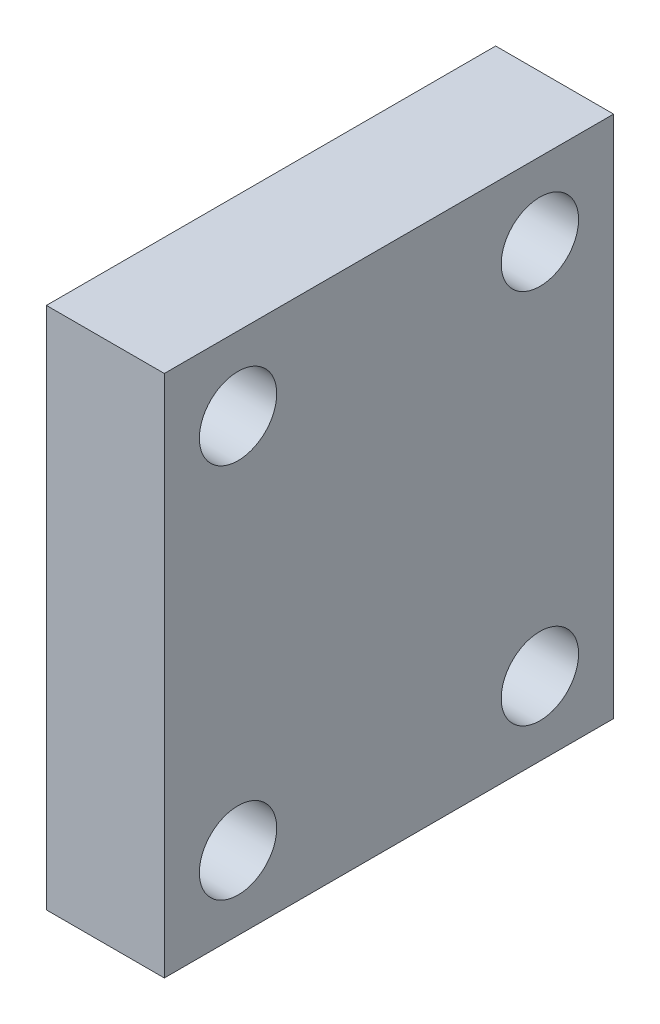
ISO-10303-21;
HEADER;
FILE_DESCRIPTION(('STEP AP214'),'2;1');
FILE_NAME('part.step','',(''),(''),'','','');
FILE_SCHEMA(('AUTOMOTIVE_DESIGN { 1 0 10303 214 1 1 1 1 }'));
ENDSEC;
DATA;
#1=APPLICATION_CONTEXT('core data for automotive mechanical design processes');
#2=APPLICATION_PROTOCOL_DEFINITION('international standard','automotive_design',2000,#1);
#3=PRODUCT_CONTEXT('',#1,'mechanical');
#4=PRODUCT('Part','Part','',(#3));
#5=PRODUCT_RELATED_PRODUCT_CATEGORY('part','',(#4));
#6=PRODUCT_DEFINITION_FORMATION('','',#4);
#7=PRODUCT_DEFINITION_CONTEXT('part definition',#1,'design');
#8=PRODUCT_DEFINITION('design','',#6,#7);
#9=PRODUCT_DEFINITION_SHAPE('','',#8);
#10=(LENGTH_UNIT() NAMED_UNIT(*) SI_UNIT(.MILLI.,.METRE.));
#11=(NAMED_UNIT(*) PLANE_ANGLE_UNIT() SI_UNIT($,.RADIAN.));
#12=(NAMED_UNIT(*) SI_UNIT($,.STERADIAN.) SOLID_ANGLE_UNIT());
#13=UNCERTAINTY_MEASURE_WITH_UNIT(LENGTH_MEASURE(1.E-05),#10,'distance_accuracy_value','');
#14=(GEOMETRIC_REPRESENTATION_CONTEXT(3) GLOBAL_UNCERTAINTY_ASSIGNED_CONTEXT((#13)) GLOBAL_UNIT_ASSIGNED_CONTEXT((#10,
#11,#12)) REPRESENTATION_CONTEXT('',''));
#15=CARTESIAN_POINT('',(0.,0.,0.));
#16=DIRECTION('',(0.,0.,1.));
#17=DIRECTION('',(1.,0.,0.));
#18=AXIS2_PLACEMENT_3D('',#15,#16,#17);
#19=CARTESIAN_POINT('',(25.4,0.,0.));
#20=DIRECTION('',(0.,1.,0.));
#21=DIRECTION('',(0.,0.,1.));
#22=AXIS2_PLACEMENT_3D('',#19,#20,#21);
#23=PLANE('',#22);
#24=DIRECTION('',(-1.,0.,0.));
#25=VECTOR('',#24,1.);
#26=CARTESIAN_POINT('',(12.7,0.,53.213));
#27=LINE('',#26,#25);
#28=CARTESIAN_POINT('',(0.,0.,53.213));
#29=VERTEX_POINT('',#28);
#30=CARTESIAN_POINT('',(12.7,0.,53.213));
#31=VERTEX_POINT('',#30);
#32=EDGE_CURVE('E148',#29,#31,#27,.F.);
#33=ORIENTED_EDGE('',*,*,#32,.F.);
#34=DIRECTION('',(0.,0.,-1.));
#35=VECTOR('',#34,1.);
#36=CARTESIAN_POINT('',(0.,0.,0.));
#37=LINE('',#36,#35);
#38=CARTESIAN_POINT('',(0.,0.,0.));
#39=VERTEX_POINT('',#38);
#40=EDGE_CURVE('E136',#29,#39,#37,.T.);
#41=ORIENTED_EDGE('',*,*,#40,.T.);
#42=DIRECTION('',(-1.,0.,0.));
#43=VECTOR('',#42,1.);
#44=CARTESIAN_POINT('',(25.4,0.,0.));
#45=LINE('',#44,#43);
#46=CARTESIAN_POINT('',(25.4,0.,0.));
#47=VERTEX_POINT('',#46);
#48=EDGE_CURVE('E287',#47,#39,#45,.T.);
#49=ORIENTED_EDGE('',*,*,#48,.F.);
#50=DIRECTION('',(0.,0.,-1.));
#51=VECTOR('',#50,1.);
#52=CARTESIAN_POINT('',(25.4,0.,0.));
#53=LINE('',#52,#51);
#54=CARTESIAN_POINT('',(25.4,0.,96.774));
#55=VERTEX_POINT('',#54);
#56=EDGE_CURVE('E264',#55,#47,#53,.T.);
#57=ORIENTED_EDGE('',*,*,#56,.F.);
#58=DIRECTION('',(-1.,0.,0.));
#59=VECTOR('',#58,1.);
#60=CARTESIAN_POINT('',(25.4,0.,96.774));
#61=LINE('',#60,#59);
#62=CARTESIAN_POINT('',(0.,0.,96.774));
#63=VERTEX_POINT('',#62);
#64=EDGE_CURVE('E273',#55,#63,#61,.T.);
#65=ORIENTED_EDGE('',*,*,#64,.T.);
#66=CARTESIAN_POINT('',(0.,0.,59.563));
#67=VERTEX_POINT('',#66);
#68=EDGE_CURVE('E145',#63,#67,#37,.T.);
#69=ORIENTED_EDGE('',*,*,#68,.T.);
#70=DIRECTION('',(-1.,0.,0.));
#71=VECTOR('',#70,1.);
#72=CARTESIAN_POINT('',(12.7,0.,59.563));
#73=LINE('',#72,#71);
#74=CARTESIAN_POINT('',(12.7,0.,59.563));
#75=VERTEX_POINT('',#74);
#76=EDGE_CURVE('E56',#75,#67,#73,.T.);
#77=ORIENTED_EDGE('',*,*,#76,.F.);
#78=DIRECTION('',(0.,0.,-1.));
#79=VECTOR('',#78,1.);
#80=CARTESIAN_POINT('',(12.7,0.,0.));
#81=LINE('',#80,#79);
#82=EDGE_CURVE('E11',#75,#31,#81,.T.);
#83=ORIENTED_EDGE('',*,*,#82,.T.);
#84=EDGE_LOOP('',(#33,#41,#49,#57,#65,#69,#77,#83));
#85=FACE_BOUND('',#84,.T.);
#86=ADVANCED_FACE('F39',(#85),#23,.F.);
#87=CARTESIAN_POINT('',(12.7,74.549,48.387));
#88=DIRECTION('',(-1.,0.,0.));
#89=DIRECTION('',(0.,0.,1.));
#90=AXIS2_PLACEMENT_3D('',#87,#88,#89);
#91=CYLINDRICAL_SURFACE('',#90,11.509375);
#92=CARTESIAN_POINT('',(2.8194,74.549,48.387));
#93=DIRECTION('',(1.,0.,0.));
#94=DIRECTION('',(0.,0.,-1.));
#95=AXIS2_PLACEMENT_3D('',#92,#93,#94);
#96=CIRCLE('',#95,11.509375);
#97=CARTESIAN_POINT('',(2.8194,71.8767199958881,37.1921515208892));
#98=VERTEX_POINT('',#97);
#99=CARTESIAN_POINT('',(2.8194,79.375,37.9382949658522));
#100=VERTEX_POINT('',#99);
#101=EDGE_CURVE('E197',#98,#100,#96,.T.);
#102=ORIENTED_EDGE('',*,*,#101,.F.);
#103=DIRECTION('',(-1.,0.,0.));
#104=VECTOR('',#103,1.);
#105=CARTESIAN_POINT('',(1.4097,71.8767199958881,37.1921515208892));
#106=LINE('',#105,#104);
#107=CARTESIAN_POINT('',(0.,71.8767199958881,37.1921515208892));
#108=VERTEX_POINT('',#107);
#109=EDGE_CURVE('E204',#98,#108,#106,.T.);
#110=ORIENTED_EDGE('',*,*,#109,.T.);
#111=CARTESIAN_POINT('',(0.,74.549,48.387));
#112=DIRECTION('',(1.,0.,0.));
#113=DIRECTION('',(0.,0.,-1.));
#114=AXIS2_PLACEMENT_3D('',#111,#112,#113);
#115=CIRCLE('',#114,11.509375);
#116=CARTESIAN_POINT('',(0.,71.8767199958881,59.5818484791108));
#117=VERTEX_POINT('',#116);
#118=EDGE_CURVE('E237',#117,#108,#115,.T.);
#119=ORIENTED_EDGE('',*,*,#118,.F.);
#120=DIRECTION('',(-1.,0.,0.));
#121=VECTOR('',#120,1.);
#122=CARTESIAN_POINT('',(1.4097,71.8767199958881,59.5818484791108));
#123=LINE('',#122,#121);
#124=CARTESIAN_POINT('',(2.8194,71.8767199958881,59.5818484791108));
#125=VERTEX_POINT('',#124);
#126=EDGE_CURVE('E201',#117,#125,#123,.F.);
#127=ORIENTED_EDGE('',*,*,#126,.T.);
#128=CARTESIAN_POINT('',(2.8194,79.375,58.8357050341478));
#129=VERTEX_POINT('',#128);
#130=EDGE_CURVE('E187',#129,#125,#96,.T.);
#131=ORIENTED_EDGE('',*,*,#130,.F.);
#132=DIRECTION('',(-1.,0.,0.));
#133=VECTOR('',#132,1.);
#134=CARTESIAN_POINT('',(6.35,79.375,58.8357050341478));
#135=LINE('',#134,#133);
#136=CARTESIAN_POINT('',(12.7,79.375,58.8357050341478));
#137=VERTEX_POINT('',#136);
#138=EDGE_CURVE('E224',#129,#137,#135,.F.);
#139=ORIENTED_EDGE('',*,*,#138,.T.);
#140=CARTESIAN_POINT('',(12.7,74.549,48.387));
#141=DIRECTION('',(1.,0.,0.));
#142=DIRECTION('',(0.,0.,-1.));
#143=AXIS2_PLACEMENT_3D('',#140,#141,#142);
#144=CIRCLE('',#143,11.509375);
#145=CARTESIAN_POINT('',(12.7,79.375,37.9382949658522));
#146=VERTEX_POINT('',#145);
#147=EDGE_CURVE('E229',#137,#146,#144,.T.);
#148=ORIENTED_EDGE('',*,*,#147,.T.);
#149=DIRECTION('',(-1.,0.,0.));
#150=VECTOR('',#149,1.);
#151=CARTESIAN_POINT('',(6.35,79.375,37.9382949658522));
#152=LINE('',#151,#150);
#153=EDGE_CURVE('E226',#146,#100,#152,.T.);
#154=ORIENTED_EDGE('',*,*,#153,.T.);
#155=EDGE_LOOP('',(#102,#110,#119,#127,#131,#139,#148,#154));
#156=FACE_BOUND('',#155,.T.);
#157=ADVANCED_FACE('F324',(#156),#91,.F.);
#158=CARTESIAN_POINT('',(12.7,28.575,48.387));
#159=DIRECTION('',(-1.,0.,0.));
#160=DIRECTION('',(0.,0.,1.));
#161=AXIS2_PLACEMENT_3D('',#158,#159,#160);
#162=CYLINDRICAL_SURFACE('',#161,11.509375);
#163=CARTESIAN_POINT('',(2.8194,28.575,48.387));
#164=DIRECTION('',(1.,0.,0.));
#165=DIRECTION('',(0.,0.,-1.));
#166=AXIS2_PLACEMENT_3D('',#163,#164,#165);
#167=CIRCLE('',#166,11.509375);
#168=CARTESIAN_POINT('',(2.8194,25.9027199958881,37.1921515208892));
#169=VERTEX_POINT('',#168);
#170=CARTESIAN_POINT('',(2.8194,33.401,37.9382949658522));
#171=VERTEX_POINT('',#170);
#172=EDGE_CURVE('E200',#169,#171,#167,.T.);
#173=ORIENTED_EDGE('',*,*,#172,.F.);
#174=DIRECTION('',(-1.,0.,0.));
#175=VECTOR('',#174,1.);
#176=CARTESIAN_POINT('',(1.4097,25.9027199958881,37.1921515208892));
#177=LINE('',#176,#175);
#178=CARTESIAN_POINT('',(0.,25.9027199958881,37.1921515208892));
#179=VERTEX_POINT('',#178);
#180=EDGE_CURVE('E210',#169,#179,#177,.T.);
#181=ORIENTED_EDGE('',*,*,#180,.T.);
#182=CARTESIAN_POINT('',(0.,28.575,48.387));
#183=DIRECTION('',(1.,0.,0.));
#184=DIRECTION('',(0.,0.,-1.));
#185=AXIS2_PLACEMENT_3D('',#182,#183,#184);
#186=CIRCLE('',#185,11.509375);
#187=CARTESIAN_POINT('',(0.,25.9027199958881,59.5818484791108));
#188=VERTEX_POINT('',#187);
#189=EDGE_CURVE('E234',#188,#179,#186,.T.);
#190=ORIENTED_EDGE('',*,*,#189,.F.);
#191=DIRECTION('',(-1.,0.,0.));
#192=VECTOR('',#191,1.);
#193=CARTESIAN_POINT('',(1.4097,25.9027199958881,59.5818484791108));
#194=LINE('',#193,#192);
#195=CARTESIAN_POINT('',(2.8194,25.9027199958881,59.5818484791108));
#196=VERTEX_POINT('',#195);
#197=EDGE_CURVE('E207',#188,#196,#194,.F.);
#198=ORIENTED_EDGE('',*,*,#197,.T.);
#199=CARTESIAN_POINT('',(2.8194,33.401,58.8357050341478));
#200=VERTEX_POINT('',#199);
#201=EDGE_CURVE('E198',#200,#196,#167,.T.);
#202=ORIENTED_EDGE('',*,*,#201,.F.);
#203=DIRECTION('',(-1.,0.,0.));
#204=VECTOR('',#203,1.);
#205=CARTESIAN_POINT('',(6.35,33.401,58.8357050341478));
#206=LINE('',#205,#204);
#207=CARTESIAN_POINT('',(12.7,33.401,58.8357050341478));
#208=VERTEX_POINT('',#207);
#209=EDGE_CURVE('E217',#200,#208,#206,.F.);
#210=ORIENTED_EDGE('',*,*,#209,.T.);
#211=CARTESIAN_POINT('',(12.7,28.575,48.387));
#212=DIRECTION('',(1.,0.,0.));
#213=DIRECTION('',(0.,0.,-1.));
#214=AXIS2_PLACEMENT_3D('',#211,#212,#213);
#215=CIRCLE('',#214,11.509375);
#216=CARTESIAN_POINT('',(12.7,33.401,37.9382949658522));
#217=VERTEX_POINT('',#216);
#218=EDGE_CURVE('E230',#208,#217,#215,.T.);
#219=ORIENTED_EDGE('',*,*,#218,.T.);
#220=DIRECTION('',(-1.,0.,0.));
#221=VECTOR('',#220,1.);
#222=CARTESIAN_POINT('',(6.35,33.401,37.9382949658522));
#223=LINE('',#222,#221);
#224=EDGE_CURVE('E221',#217,#171,#223,.T.);
#225=ORIENTED_EDGE('',*,*,#224,.T.);
#226=EDGE_LOOP('',(#173,#181,#190,#198,#202,#210,#219,#225));
#227=FACE_BOUND('',#226,.T.);
#228=ADVANCED_FACE('F300',(#227),#162,.F.);
#229=CARTESIAN_POINT('',(25.4,0.,0.));
#230=DIRECTION('',(0.,0.,1.));
#231=DIRECTION('',(1.,0.,0.));
#232=AXIS2_PLACEMENT_3D('',#229,#230,#231);
#233=PLANE('',#232);
#234=DIRECTION('',(0.,1.,0.));
#235=VECTOR('',#234,1.);
#236=CARTESIAN_POINT('',(0.,0.,0.));
#237=LINE('',#236,#235);
#238=CARTESIAN_POINT('',(0.,112.776,0.));
#239=VERTEX_POINT('',#238);
#240=EDGE_CURVE('E142',#39,#239,#237,.T.);
#241=ORIENTED_EDGE('',*,*,#240,.T.);
#242=DIRECTION('',(-1.,0.,0.));
#243=VECTOR('',#242,1.);
#244=CARTESIAN_POINT('',(25.4,112.776,0.));
#245=LINE('',#244,#243);
#246=CARTESIAN_POINT('',(25.4,112.776,0.));
#247=VERTEX_POINT('',#246);
#248=EDGE_CURVE('E284',#247,#239,#245,.T.);
#249=ORIENTED_EDGE('',*,*,#248,.F.);
#250=DIRECTION('',(0.,1.,0.));
#251=VECTOR('',#250,1.);
#252=CARTESIAN_POINT('',(25.4,0.,0.));
#253=LINE('',#252,#251);
#254=EDGE_CURVE('E267',#47,#247,#253,.T.);
#255=ORIENTED_EDGE('',*,*,#254,.F.);
#256=ORIENTED_EDGE('',*,*,#48,.T.);
#257=EDGE_LOOP('',(#241,#249,#255,#256));
#258=FACE_BOUND('',#257,.T.);
#259=ADVANCED_FACE('F336',(#258),#233,.F.);
#260=CARTESIAN_POINT('',(25.4,112.776,0.));
#261=DIRECTION('',(0.,-1.,0.));
#262=DIRECTION('',(0.,0.,-1.));
#263=AXIS2_PLACEMENT_3D('',#260,#261,#262);
#264=PLANE('',#263);
#265=DIRECTION('',(0.,0.,1.));
#266=VECTOR('',#265,1.);
#267=CARTESIAN_POINT('',(0.,112.776,0.));
#268=LINE('',#267,#266);
#269=CARTESIAN_POINT('',(0.,112.776,96.774));
#270=VERTEX_POINT('',#269);
#271=EDGE_CURVE('E276',#239,#270,#268,.T.);
#272=ORIENTED_EDGE('',*,*,#271,.T.);
#273=DIRECTION('',(-1.,0.,0.));
#274=VECTOR('',#273,1.);
#275=CARTESIAN_POINT('',(25.4,112.776,96.774));
#276=LINE('',#275,#274);
#277=CARTESIAN_POINT('',(25.4,112.776,96.774));
#278=VERTEX_POINT('',#277);
#279=EDGE_CURVE('E281',#278,#270,#276,.T.);
#280=ORIENTED_EDGE('',*,*,#279,.F.);
#281=DIRECTION('',(0.,0.,1.));
#282=VECTOR('',#281,1.);
#283=CARTESIAN_POINT('',(25.4,112.776,0.));
#284=LINE('',#283,#282);
#285=EDGE_CURVE('E270',#247,#278,#284,.T.);
#286=ORIENTED_EDGE('',*,*,#285,.F.);
#287=ORIENTED_EDGE('',*,*,#248,.T.);
#288=EDGE_LOOP('',(#272,#280,#286,#287));
#289=FACE_BOUND('',#288,.T.);
#290=ADVANCED_FACE('F370',(#289),#264,.F.);
#291=CARTESIAN_POINT('',(25.4,0.,96.774));
#292=DIRECTION('',(0.,0.,-1.));
#293=DIRECTION('',(-1.,0.,0.));
#294=AXIS2_PLACEMENT_3D('',#291,#292,#293);
#295=PLANE('',#294);
#296=DIRECTION('',(0.,-1.,0.));
#297=VECTOR('',#296,1.);
#298=CARTESIAN_POINT('',(0.,0.,96.774));
#299=LINE('',#298,#297);
#300=EDGE_CURVE('E268',#270,#63,#299,.T.);
#301=ORIENTED_EDGE('',*,*,#300,.T.);
#302=ORIENTED_EDGE('',*,*,#64,.F.);
#303=DIRECTION('',(0.,-1.,0.));
#304=VECTOR('',#303,1.);
#305=CARTESIAN_POINT('',(25.4,0.,96.774));
#306=LINE('',#305,#304);
#307=EDGE_CURVE('E272',#278,#55,#306,.T.);
#308=ORIENTED_EDGE('',*,*,#307,.F.);
#309=ORIENTED_EDGE('',*,*,#279,.T.);
#310=EDGE_LOOP('',(#301,#302,#308,#309));
#311=FACE_BOUND('',#310,.T.);
#312=ADVANCED_FACE('F364',(#311),#295,.F.);
#313=CARTESIAN_POINT('',(25.4,0.,0.));
#314=DIRECTION('',(-1.,0.,0.));
#315=DIRECTION('',(0.,0.,1.));
#316=AXIS2_PLACEMENT_3D('',#313,#314,#315);
#317=PLANE('',#316);
#318=CARTESIAN_POINT('',(25.4,96.901,15.875));
#319=DIRECTION('',(1.,0.,0.));
#320=DIRECTION('',(0.,0.,-1.));
#321=AXIS2_PLACEMENT_3D('',#318,#319,#320);
#322=CIRCLE('',#321,8.334375);
#323=CARTESIAN_POINT('',(25.4,96.901,7.540625));
#324=VERTEX_POINT('',#323);
#325=EDGE_CURVE('E252',#324,#324,#322,.T.);
#326=ORIENTED_EDGE('',*,*,#325,.F.);
#327=EDGE_LOOP('',(#326));
#328=FACE_BOUND('',#327,.T.);
#329=CARTESIAN_POINT('',(25.4,15.875,80.899));
#330=DIRECTION('',(1.,0.,0.));
#331=DIRECTION('',(0.,0.,-1.));
#332=AXIS2_PLACEMENT_3D('',#329,#330,#331);
#333=CIRCLE('',#332,8.334375);
#334=CARTESIAN_POINT('',(25.4,15.875,72.564625));
#335=VERTEX_POINT('',#334);
#336=EDGE_CURVE('E245',#335,#335,#333,.T.);
#337=ORIENTED_EDGE('',*,*,#336,.F.);
#338=EDGE_LOOP('',(#337));
#339=FACE_BOUND('',#338,.T.);
#340=CARTESIAN_POINT('',(25.4,96.901,80.899));
#341=DIRECTION('',(1.,0.,0.));
#342=DIRECTION('',(0.,0.,-1.));
#343=AXIS2_PLACEMENT_3D('',#340,#341,#342);
#344=CIRCLE('',#343,8.33437500000001);
#345=CARTESIAN_POINT('',(25.4,96.901,72.564625));
#346=VERTEX_POINT('',#345);
#347=EDGE_CURVE('E233',#346,#346,#344,.T.);
#348=ORIENTED_EDGE('',*,*,#347,.F.);
#349=EDGE_LOOP('',(#348));
#350=FACE_BOUND('',#349,.T.);
#351=CARTESIAN_POINT('',(25.4,15.875,15.875));
#352=DIRECTION('',(1.,0.,0.));
#353=DIRECTION('',(0.,0.,-1.));
#354=AXIS2_PLACEMENT_3D('',#351,#352,#353);
#355=CIRCLE('',#354,8.334375);
#356=CARTESIAN_POINT('',(25.4,15.875,7.540625));
#357=VERTEX_POINT('',#356);
#358=EDGE_CURVE('E146',#357,#357,#355,.T.);
#359=ORIENTED_EDGE('',*,*,#358,.F.);
#360=EDGE_LOOP('',(#359));
#361=FACE_BOUND('',#360,.T.);
#362=ORIENTED_EDGE('',*,*,#56,.T.);
#363=ORIENTED_EDGE('',*,*,#254,.T.);
#364=ORIENTED_EDGE('',*,*,#285,.T.);
#365=ORIENTED_EDGE('',*,*,#307,.T.);
#366=EDGE_LOOP('',(#362,#363,#364,#365));
#367=FACE_BOUND('',#366,.T.);
#368=ADVANCED_FACE('F361',(#328,#339,#350,#361,#367),#317,.F.);
#369=CARTESIAN_POINT('',(0.,0.,0.));
#370=DIRECTION('',(-1.,0.,0.));
#371=DIRECTION('',(0.,0.,1.));
#372=AXIS2_PLACEMENT_3D('',#369,#370,#371);
#373=PLANE('',#372);
#374=CARTESIAN_POINT('',(0.,7.239,48.387));
#375=DIRECTION('',(1.,0.,0.));
#376=DIRECTION('',(0.,0.,-1.));
#377=AXIS2_PLACEMENT_3D('',#374,#375,#376);
#378=CIRCLE('',#377,3.175);
#379=CARTESIAN_POINT('',(0.,7.239,45.212));
#380=VERTEX_POINT('',#379);
#381=EDGE_CURVE('E164',#380,#380,#378,.T.);
#382=ORIENTED_EDGE('',*,*,#381,.T.);
#383=EDGE_LOOP('',(#382));
#384=FACE_BOUND('',#383,.T.);
#385=CARTESIAN_POINT('',(0.,56.261,80.899));
#386=DIRECTION('',(1.,0.,0.));
#387=DIRECTION('',(0.,0.,-1.));
#388=AXIS2_PLACEMENT_3D('',#385,#386,#387);
#389=CIRCLE('',#388,3.175);
#390=CARTESIAN_POINT('',(0.,56.261,77.724));
#391=VERTEX_POINT('',#390);
#392=EDGE_CURVE('E167',#391,#391,#389,.T.);
#393=ORIENTED_EDGE('',*,*,#392,.T.);
#394=EDGE_LOOP('',(#393));
#395=FACE_BOUND('',#394,.T.);
#396=CARTESIAN_POINT('',(0.,105.537,48.387));
#397=DIRECTION('',(1.,0.,0.));
#398=DIRECTION('',(0.,0.,-1.));
#399=AXIS2_PLACEMENT_3D('',#396,#397,#398);
#400=CIRCLE('',#399,3.57187500000001);
#401=CARTESIAN_POINT('',(0.,105.537,44.815125));
#402=VERTEX_POINT('',#401);
#403=EDGE_CURVE('E176',#402,#402,#400,.T.);
#404=ORIENTED_EDGE('',*,*,#403,.T.);
#405=EDGE_LOOP('',(#404));
#406=FACE_BOUND('',#405,.T.);
#407=CARTESIAN_POINT('',(0.,56.515,15.875));
#408=DIRECTION('',(1.,0.,0.));
#409=DIRECTION('',(0.,0.,-1.));
#410=AXIS2_PLACEMENT_3D('',#407,#408,#409);
#411=CIRCLE('',#410,3.571875);
#412=CARTESIAN_POINT('',(0.,56.515,12.303125));
#413=VERTEX_POINT('',#412);
#414=EDGE_CURVE('E179',#413,#413,#411,.T.);
#415=ORIENTED_EDGE('',*,*,#414,.T.);
#416=EDGE_LOOP('',(#415));
#417=FACE_BOUND('',#416,.T.);
#418=ORIENTED_EDGE('',*,*,#189,.T.);
#419=CARTESIAN_POINT('',(0.,38.227,48.387));
#420=DIRECTION('',(1.,0.,0.));
#421=DIRECTION('',(0.,0.,-1.));
#422=AXIS2_PLACEMENT_3D('',#419,#420,#421);
#423=CIRCLE('',#422,16.6497);
#424=EDGE_CURVE('E188',#179,#188,#423,.T.);
#425=ORIENTED_EDGE('',*,*,#424,.T.);
#426=EDGE_LOOP('',(#418,#425));
#427=FACE_BOUND('',#426,.T.);
#428=ORIENTED_EDGE('',*,*,#118,.T.);
#429=CARTESIAN_POINT('',(0.,84.201,48.387));
#430=DIRECTION('',(1.,0.,0.));
#431=DIRECTION('',(0.,0.,-1.));
#432=AXIS2_PLACEMENT_3D('',#429,#430,#431);
#433=CIRCLE('',#432,16.6497);
#434=EDGE_CURVE('E191',#108,#117,#433,.T.);
#435=ORIENTED_EDGE('',*,*,#434,.T.);
#436=EDGE_LOOP('',(#428,#435));
#437=FACE_BOUND('',#436,.T.);
#438=CARTESIAN_POINT('',(0.,96.901,15.875));
#439=DIRECTION('',(1.,0.,0.));
#440=DIRECTION('',(0.,0.,-1.));
#441=AXIS2_PLACEMENT_3D('',#438,#439,#440);
#442=CIRCLE('',#441,8.334375);
#443=CARTESIAN_POINT('',(0.,96.901,7.540625));
#444=VERTEX_POINT('',#443);
#445=EDGE_CURVE('E248',#444,#444,#442,.T.);
#446=ORIENTED_EDGE('',*,*,#445,.T.);
#447=EDGE_LOOP('',(#446));
#448=FACE_BOUND('',#447,.T.);
#449=CARTESIAN_POINT('',(0.,15.875,80.899));
#450=DIRECTION('',(1.,0.,0.));
#451=DIRECTION('',(0.,0.,-1.));
#452=AXIS2_PLACEMENT_3D('',#449,#450,#451);
#453=CIRCLE('',#452,8.334375);
#454=CARTESIAN_POINT('',(0.,15.875,72.564625));
#455=VERTEX_POINT('',#454);
#456=EDGE_CURVE('E255',#455,#455,#453,.T.);
#457=ORIENTED_EDGE('',*,*,#456,.T.);
#458=EDGE_LOOP('',(#457));
#459=FACE_BOUND('',#458,.T.);
#460=CARTESIAN_POINT('',(0.,96.901,80.899));
#461=DIRECTION('',(1.,0.,0.));
#462=DIRECTION('',(0.,0.,-1.));
#463=AXIS2_PLACEMENT_3D('',#460,#461,#462);
#464=CIRCLE('',#463,8.33437500000001);
#465=CARTESIAN_POINT('',(0.,96.901,72.564625));
#466=VERTEX_POINT('',#465);
#467=EDGE_CURVE('E242',#466,#466,#464,.T.);
#468=ORIENTED_EDGE('',*,*,#467,.T.);
#469=EDGE_LOOP('',(#468));
#470=FACE_BOUND('',#469,.T.);
#471=CARTESIAN_POINT('',(0.,15.875,15.875));
#472=DIRECTION('',(1.,0.,0.));
#473=DIRECTION('',(0.,0.,-1.));
#474=AXIS2_PLACEMENT_3D('',#471,#472,#473);
#475=CIRCLE('',#474,8.334375);
#476=CARTESIAN_POINT('',(0.,15.875,7.540625));
#477=VERTEX_POINT('',#476);
#478=EDGE_CURVE('E251',#477,#477,#475,.T.);
#479=ORIENTED_EDGE('',*,*,#478,.T.);
#480=EDGE_LOOP('',(#479));
#481=FACE_BOUND('',#480,.T.);
#482=ORIENTED_EDGE('',*,*,#40,.F.);
#483=CARTESIAN_POINT('',(0.,0.,56.388));
#484=DIRECTION('',(1.,0.,0.));
#485=DIRECTION('',(0.,0.,-1.));
#486=AXIS2_PLACEMENT_3D('',#483,#484,#485);
#487=CIRCLE('',#486,3.175);
#488=EDGE_CURVE('E140',#67,#29,#487,.T.);
#489=ORIENTED_EDGE('',*,*,#488,.F.);
#490=ORIENTED_EDGE('',*,*,#68,.F.);
#491=ORIENTED_EDGE('',*,*,#300,.F.);
#492=ORIENTED_EDGE('',*,*,#271,.F.);
#493=ORIENTED_EDGE('',*,*,#240,.F.);
#494=EDGE_LOOP('',(#482,#489,#490,#491,#492,#493));
#495=FACE_BOUND('',#494,.T.);
#496=ADVANCED_FACE('F137',(#384,#395,#406,#417,#427,#437,#448,#459,#470,#481,#495),#373,.T.);
#497=CARTESIAN_POINT('',(25.4,15.875,15.875));
#498=DIRECTION('',(-1.,0.,0.));
#499=DIRECTION('',(0.,0.,1.));
#500=AXIS2_PLACEMENT_3D('',#497,#498,#499);
#501=CYLINDRICAL_SURFACE('',#500,8.334375);
#502=ORIENTED_EDGE('',*,*,#358,.T.);
#503=EDGE_LOOP('',(#502));
#504=FACE_BOUND('',#503,.T.);
#505=ORIENTED_EDGE('',*,*,#478,.F.);
#506=EDGE_LOOP('',(#505));
#507=FACE_BOUND('',#506,.T.);
#508=ADVANCED_FACE('F350',(#504,#507),#501,.F.);
#509=CARTESIAN_POINT('',(25.4,96.901,80.899));
#510=DIRECTION('',(-1.,0.,0.));
#511=DIRECTION('',(0.,0.,1.));
#512=AXIS2_PLACEMENT_3D('',#509,#510,#511);
#513=CYLINDRICAL_SURFACE('',#512,8.33437500000001);
#514=ORIENTED_EDGE('',*,*,#347,.T.);
#515=EDGE_LOOP('',(#514));
#516=FACE_BOUND('',#515,.T.);
#517=ORIENTED_EDGE('',*,*,#467,.F.);
#518=EDGE_LOOP('',(#517));
#519=FACE_BOUND('',#518,.T.);
#520=ADVANCED_FACE('F346',(#516,#519),#513,.F.);
#521=CARTESIAN_POINT('',(25.4,15.875,80.899));
#522=DIRECTION('',(-1.,0.,0.));
#523=DIRECTION('',(0.,0.,1.));
#524=AXIS2_PLACEMENT_3D('',#521,#522,#523);
#525=CYLINDRICAL_SURFACE('',#524,8.334375);
#526=ORIENTED_EDGE('',*,*,#336,.T.);
#527=EDGE_LOOP('',(#526));
#528=FACE_BOUND('',#527,.T.);
#529=ORIENTED_EDGE('',*,*,#456,.F.);
#530=EDGE_LOOP('',(#529));
#531=FACE_BOUND('',#530,.T.);
#532=ADVANCED_FACE('F349',(#528,#531),#525,.F.);
#533=CARTESIAN_POINT('',(25.4,96.901,15.875));
#534=DIRECTION('',(-1.,0.,0.));
#535=DIRECTION('',(0.,0.,1.));
#536=AXIS2_PLACEMENT_3D('',#533,#534,#535);
#537=CYLINDRICAL_SURFACE('',#536,8.334375);
#538=ORIENTED_EDGE('',*,*,#325,.T.);
#539=EDGE_LOOP('',(#538));
#540=FACE_BOUND('',#539,.T.);
#541=ORIENTED_EDGE('',*,*,#445,.F.);
#542=EDGE_LOOP('',(#541));
#543=FACE_BOUND('',#542,.T.);
#544=ADVANCED_FACE('F344',(#540,#543),#537,.F.);
#545=CARTESIAN_POINT('',(12.7,74.549,48.387));
#546=DIRECTION('',(1.,0.,0.));
#547=DIRECTION('',(0.,0.,-1.));
#548=AXIS2_PLACEMENT_3D('',#545,#546,#547);
#549=PLANE('',#548);
#550=ORIENTED_EDGE('',*,*,#147,.F.);
#551=CARTESIAN_POINT('',(12.7,84.201,48.387));
#552=DIRECTION('',(1.,0.,0.));
#553=DIRECTION('',(0.,0.,-1.));
#554=AXIS2_PLACEMENT_3D('',#551,#552,#553);
#555=CIRCLE('',#554,11.509375);
#556=EDGE_CURVE('E213',#146,#137,#555,.T.);
#557=ORIENTED_EDGE('',*,*,#556,.F.);
#558=EDGE_LOOP('',(#550,#557));
#559=FACE_BOUND('',#558,.T.);
#560=ADVANCED_FACE('F341',(#559),#549,.F.);
#561=CARTESIAN_POINT('',(12.7,28.575,48.387));
#562=DIRECTION('',(1.,0.,0.));
#563=DIRECTION('',(0.,0.,-1.));
#564=AXIS2_PLACEMENT_3D('',#561,#562,#563);
#565=PLANE('',#564);
#566=ORIENTED_EDGE('',*,*,#218,.F.);
#567=CARTESIAN_POINT('',(12.7,38.227,48.387));
#568=DIRECTION('',(1.,0.,0.));
#569=DIRECTION('',(0.,0.,-1.));
#570=AXIS2_PLACEMENT_3D('',#567,#568,#569);
#571=CIRCLE('',#570,11.509375);
#572=EDGE_CURVE('E214',#217,#208,#571,.T.);
#573=ORIENTED_EDGE('',*,*,#572,.F.);
#574=EDGE_LOOP('',(#566,#573));
#575=FACE_BOUND('',#574,.T.);
#576=ADVANCED_FACE('F305',(#575),#565,.F.);
#577=CARTESIAN_POINT('',(12.7,38.227,48.387));
#578=DIRECTION('',(-1.,0.,0.));
#579=DIRECTION('',(0.,0.,1.));
#580=AXIS2_PLACEMENT_3D('',#577,#578,#579);
#581=CYLINDRICAL_SURFACE('',#580,11.509375);
#582=CARTESIAN_POINT('',(2.8194,38.227,48.387));
#583=DIRECTION('',(1.,0.,0.));
#584=DIRECTION('',(0.,0.,-1.));
#585=AXIS2_PLACEMENT_3D('',#582,#583,#584);
#586=CIRCLE('',#585,11.509375);
#587=EDGE_CURVE('E46',#171,#200,#586,.T.);
#588=ORIENTED_EDGE('',*,*,#587,.F.);
#589=ORIENTED_EDGE('',*,*,#224,.F.);
#590=ORIENTED_EDGE('',*,*,#572,.T.);
#591=ORIENTED_EDGE('',*,*,#209,.F.);
#592=EDGE_LOOP('',(#588,#589,#590,#591));
#593=FACE_BOUND('',#592,.T.);
#594=ADVANCED_FACE('F302',(#593),#581,.F.);
#595=CARTESIAN_POINT('',(12.7,84.201,48.387));
#596=DIRECTION('',(-1.,0.,0.));
#597=DIRECTION('',(0.,0.,1.));
#598=AXIS2_PLACEMENT_3D('',#595,#596,#597);
#599=CYLINDRICAL_SURFACE('',#598,11.509375);
#600=CARTESIAN_POINT('',(2.8194,84.201,48.387));
#601=DIRECTION('',(1.,0.,0.));
#602=DIRECTION('',(0.,0.,-1.));
#603=AXIS2_PLACEMENT_3D('',#600,#601,#602);
#604=CIRCLE('',#603,11.509375);
#605=EDGE_CURVE('E289',#100,#129,#604,.T.);
#606=ORIENTED_EDGE('',*,*,#605,.F.);
#607=ORIENTED_EDGE('',*,*,#153,.F.);
#608=ORIENTED_EDGE('',*,*,#556,.T.);
#609=ORIENTED_EDGE('',*,*,#138,.F.);
#610=EDGE_LOOP('',(#606,#607,#608,#609));
#611=FACE_BOUND('',#610,.T.);
#612=ADVANCED_FACE('F444',(#611),#599,.F.);
#613=CARTESIAN_POINT('',(2.8194,84.201,48.387));
#614=DIRECTION('',(-1.,0.,0.));
#615=DIRECTION('',(0.,0.,1.));
#616=AXIS2_PLACEMENT_3D('',#613,#614,#615);
#617=CYLINDRICAL_SURFACE('',#616,16.6497);
#618=CARTESIAN_POINT('',(2.8194,84.201,48.387));
#619=DIRECTION('',(1.,0.,0.));
#620=DIRECTION('',(0.,0.,-1.));
#621=AXIS2_PLACEMENT_3D('',#618,#619,#620);
#622=CIRCLE('',#621,16.6497);
#623=EDGE_CURVE('E175',#98,#125,#622,.T.);
#624=ORIENTED_EDGE('',*,*,#623,.T.);
#625=ORIENTED_EDGE('',*,*,#126,.F.);
#626=ORIENTED_EDGE('',*,*,#434,.F.);
#627=ORIENTED_EDGE('',*,*,#109,.F.);
#628=EDGE_LOOP('',(#624,#625,#626,#627));
#629=FACE_BOUND('',#628,.T.);
#630=ADVANCED_FACE('F319',(#629),#617,.F.);
#631=CARTESIAN_POINT('',(2.8194,84.201,48.387));
#632=DIRECTION('',(1.,0.,0.));
#633=DIRECTION('',(0.,0.,-1.));
#634=AXIS2_PLACEMENT_3D('',#631,#632,#633);
#635=PLANE('',#634);
#636=ORIENTED_EDGE('',*,*,#101,.T.);
#637=ORIENTED_EDGE('',*,*,#605,.T.);
#638=ORIENTED_EDGE('',*,*,#130,.T.);
#639=ORIENTED_EDGE('',*,*,#623,.F.);
#640=EDGE_LOOP('',(#636,#637,#638,#639));
#641=FACE_BOUND('',#640,.T.);
#642=ADVANCED_FACE('F311',(#641),#635,.F.);
#643=CARTESIAN_POINT('',(2.8194,38.227,48.387));
#644=DIRECTION('',(-1.,0.,0.));
#645=DIRECTION('',(0.,0.,1.));
#646=AXIS2_PLACEMENT_3D('',#643,#644,#645);
#647=CYLINDRICAL_SURFACE('',#646,16.6497);
#648=CARTESIAN_POINT('',(2.8194,38.227,48.387));
#649=DIRECTION('',(1.,0.,0.));
#650=DIRECTION('',(0.,0.,-1.));
#651=AXIS2_PLACEMENT_3D('',#648,#649,#650);
#652=CIRCLE('',#651,16.6497);
#653=EDGE_CURVE('E184',#169,#196,#652,.T.);
#654=ORIENTED_EDGE('',*,*,#653,.T.);
#655=ORIENTED_EDGE('',*,*,#197,.F.);
#656=ORIENTED_EDGE('',*,*,#424,.F.);
#657=ORIENTED_EDGE('',*,*,#180,.F.);
#658=EDGE_LOOP('',(#654,#655,#656,#657));
#659=FACE_BOUND('',#658,.T.);
#660=ADVANCED_FACE('F309',(#659),#647,.F.);
#661=CARTESIAN_POINT('',(2.8194,38.227,48.387));
#662=DIRECTION('',(1.,0.,0.));
#663=DIRECTION('',(0.,0.,-1.));
#664=AXIS2_PLACEMENT_3D('',#661,#662,#663);
#665=PLANE('',#664);
#666=ORIENTED_EDGE('',*,*,#172,.T.);
#667=ORIENTED_EDGE('',*,*,#587,.T.);
#668=ORIENTED_EDGE('',*,*,#201,.T.);
#669=ORIENTED_EDGE('',*,*,#653,.F.);
#670=EDGE_LOOP('',(#666,#667,#668,#669));
#671=FACE_BOUND('',#670,.T.);
#672=ADVANCED_FACE('F293',(#671),#665,.F.);
#673=CARTESIAN_POINT('',(7.874,56.515,15.875));
#674=DIRECTION('',(-1.,0.,0.));
#675=DIRECTION('',(0.,0.,1.));
#676=AXIS2_PLACEMENT_3D('',#673,#674,#675);
#677=CYLINDRICAL_SURFACE('',#676,3.571875);
#678=CARTESIAN_POINT('',(7.874,56.515,15.875));
#679=DIRECTION('',(1.,0.,0.));
#680=DIRECTION('',(0.,0.,-1.));
#681=AXIS2_PLACEMENT_3D('',#678,#679,#680);
#682=CIRCLE('',#681,3.571875);
#683=CARTESIAN_POINT('',(7.874,56.515,12.303125));
#684=VERTEX_POINT('',#683);
#685=EDGE_CURVE('E163',#684,#684,#682,.T.);
#686=ORIENTED_EDGE('',*,*,#685,.T.);
#687=EDGE_LOOP('',(#686));
#688=FACE_BOUND('',#687,.T.);
#689=ORIENTED_EDGE('',*,*,#414,.F.);
#690=EDGE_LOOP('',(#689));
#691=FACE_BOUND('',#690,.T.);
#692=ADVANCED_FACE('F317',(#688,#691),#677,.F.);
#693=CARTESIAN_POINT('',(7.874,56.515,15.875));
#694=DIRECTION('',(1.,0.,0.));
#695=DIRECTION('',(0.,0.,-1.));
#696=AXIS2_PLACEMENT_3D('',#693,#694,#695);
#697=PLANE('',#696);
#698=ORIENTED_EDGE('',*,*,#685,.F.);
#699=EDGE_LOOP('',(#698));
#700=FACE_BOUND('',#699,.T.);
#701=ADVANCED_FACE('F495',(#700),#697,.F.);
#702=CARTESIAN_POINT('',(7.874,105.537,48.387));
#703=DIRECTION('',(-1.,0.,0.));
#704=DIRECTION('',(0.,0.,1.));
#705=AXIS2_PLACEMENT_3D('',#702,#703,#704);
#706=CYLINDRICAL_SURFACE('',#705,3.57187500000001);
#707=CARTESIAN_POINT('',(7.874,105.537,48.387));
#708=DIRECTION('',(1.,0.,0.));
#709=DIRECTION('',(0.,0.,-1.));
#710=AXIS2_PLACEMENT_3D('',#707,#708,#709);
#711=CIRCLE('',#710,3.57187500000001);
#712=CARTESIAN_POINT('',(7.874,105.537,44.815125));
#713=VERTEX_POINT('',#712);
#714=EDGE_CURVE('E172',#713,#713,#711,.T.);
#715=ORIENTED_EDGE('',*,*,#714,.T.);
#716=EDGE_LOOP('',(#715));
#717=FACE_BOUND('',#716,.T.);
#718=ORIENTED_EDGE('',*,*,#403,.F.);
#719=EDGE_LOOP('',(#718));
#720=FACE_BOUND('',#719,.T.);
#721=ADVANCED_FACE('F505',(#717,#720),#706,.F.);
#722=CARTESIAN_POINT('',(7.874,105.537,48.387));
#723=DIRECTION('',(1.,0.,0.));
#724=DIRECTION('',(0.,0.,-1.));
#725=AXIS2_PLACEMENT_3D('',#722,#723,#724);
#726=PLANE('',#725);
#727=ORIENTED_EDGE('',*,*,#714,.F.);
#728=EDGE_LOOP('',(#727));
#729=FACE_BOUND('',#728,.T.);
#730=ADVANCED_FACE('F515',(#729),#726,.F.);
#731=CARTESIAN_POINT('',(7.874,56.261,80.899));
#732=DIRECTION('',(-1.,0.,0.));
#733=DIRECTION('',(0.,0.,1.));
#734=AXIS2_PLACEMENT_3D('',#731,#732,#733);
#735=CYLINDRICAL_SURFACE('',#734,3.175);
#736=CARTESIAN_POINT('',(7.874,56.261,80.899));
#737=DIRECTION('',(1.,0.,0.));
#738=DIRECTION('',(0.,0.,-1.));
#739=AXIS2_PLACEMENT_3D('',#736,#737,#738);
#740=CIRCLE('',#739,3.175);
#741=CARTESIAN_POINT('',(7.874,56.261,77.724));
#742=VERTEX_POINT('',#741);
#743=EDGE_CURVE('E152',#742,#742,#740,.T.);
#744=ORIENTED_EDGE('',*,*,#743,.T.);
#745=EDGE_LOOP('',(#744));
#746=FACE_BOUND('',#745,.T.);
#747=ORIENTED_EDGE('',*,*,#392,.F.);
#748=EDGE_LOOP('',(#747));
#749=FACE_BOUND('',#748,.T.);
#750=ADVANCED_FACE('F525',(#746,#749),#735,.F.);
#751=CARTESIAN_POINT('',(7.874,56.261,80.899));
#752=DIRECTION('',(1.,0.,0.));
#753=DIRECTION('',(0.,0.,-1.));
#754=AXIS2_PLACEMENT_3D('',#751,#752,#753);
#755=PLANE('',#754);
#756=ORIENTED_EDGE('',*,*,#743,.F.);
#757=EDGE_LOOP('',(#756));
#758=FACE_BOUND('',#757,.T.);
#759=ADVANCED_FACE('F535',(#758),#755,.F.);
#760=CARTESIAN_POINT('',(7.874,7.239,48.387));
#761=DIRECTION('',(-1.,0.,0.));
#762=DIRECTION('',(0.,0.,1.));
#763=AXIS2_PLACEMENT_3D('',#760,#761,#762);
#764=CYLINDRICAL_SURFACE('',#763,3.175);
#765=CARTESIAN_POINT('',(7.874,7.239,48.387));
#766=DIRECTION('',(1.,0.,0.));
#767=DIRECTION('',(0.,0.,-1.));
#768=AXIS2_PLACEMENT_3D('',#765,#766,#767);
#769=CIRCLE('',#768,3.175);
#770=CARTESIAN_POINT('',(7.874,7.239,45.212));
#771=VERTEX_POINT('',#770);
#772=EDGE_CURVE('E160',#771,#771,#769,.T.);
#773=ORIENTED_EDGE('',*,*,#772,.T.);
#774=EDGE_LOOP('',(#773));
#775=FACE_BOUND('',#774,.T.);
#776=ORIENTED_EDGE('',*,*,#381,.F.);
#777=EDGE_LOOP('',(#776));
#778=FACE_BOUND('',#777,.T.);
#779=ADVANCED_FACE('F545',(#775,#778),#764,.F.);
#780=CARTESIAN_POINT('',(7.874,7.239,48.387));
#781=DIRECTION('',(1.,0.,0.));
#782=DIRECTION('',(0.,0.,-1.));
#783=AXIS2_PLACEMENT_3D('',#780,#781,#782);
#784=PLANE('',#783);
#785=ORIENTED_EDGE('',*,*,#772,.F.);
#786=EDGE_LOOP('',(#785));
#787=FACE_BOUND('',#786,.T.);
#788=ADVANCED_FACE('F555',(#787),#784,.F.);
#789=CARTESIAN_POINT('',(12.7,0.,56.388));
#790=DIRECTION('',(1.,0.,0.));
#791=DIRECTION('',(0.,0.,-1.));
#792=AXIS2_PLACEMENT_3D('',#789,#790,#791);
#793=PLANE('',#792);
#794=ORIENTED_EDGE('',*,*,#82,.F.);
#795=CARTESIAN_POINT('',(12.7,0.,56.388));
#796=DIRECTION('',(1.,0.,0.));
#797=DIRECTION('',(0.,0.,-1.));
#798=AXIS2_PLACEMENT_3D('',#795,#796,#797);
#799=CIRCLE('',#798,3.175);
#800=EDGE_CURVE('E155',#75,#31,#799,.T.);
#801=ORIENTED_EDGE('',*,*,#800,.T.);
#802=EDGE_LOOP('',(#794,#801));
#803=FACE_BOUND('',#802,.T.);
#804=ADVANCED_FACE('F564',(#803),#793,.T.);
#805=CARTESIAN_POINT('',(12.7,0.,56.388));
#806=DIRECTION('',(-1.,0.,0.));
#807=DIRECTION('',(0.,0.,1.));
#808=AXIS2_PLACEMENT_3D('',#805,#806,#807);
#809=CYLINDRICAL_SURFACE('',#808,3.175);
#810=ORIENTED_EDGE('',*,*,#488,.T.);
#811=ORIENTED_EDGE('',*,*,#32,.T.);
#812=ORIENTED_EDGE('',*,*,#800,.F.);
#813=ORIENTED_EDGE('',*,*,#76,.T.);
#814=EDGE_LOOP('',(#810,#811,#812,#813));
#815=FACE_BOUND('',#814,.T.);
#816=ADVANCED_FACE('F154',(#815),#809,.T.);
#817=CLOSED_SHELL('',(#86,#157,#228,#259,#290,#312,#368,#496,#508,#520,#532,#544,#560,#576,#594,
#612,#630,#642,#660,#672,#692,#701,#721,#730,#750,#759,#779,#788,#804,#816));
#818=MANIFOLD_SOLID_BREP('B2',#817);
#819=ADVANCED_BREP_SHAPE_REPRESENTATION('',(#18,#818),#14);
#820=SHAPE_DEFINITION_REPRESENTATION(#9,#819);
ENDSEC;
END-ISO-10303-21;
